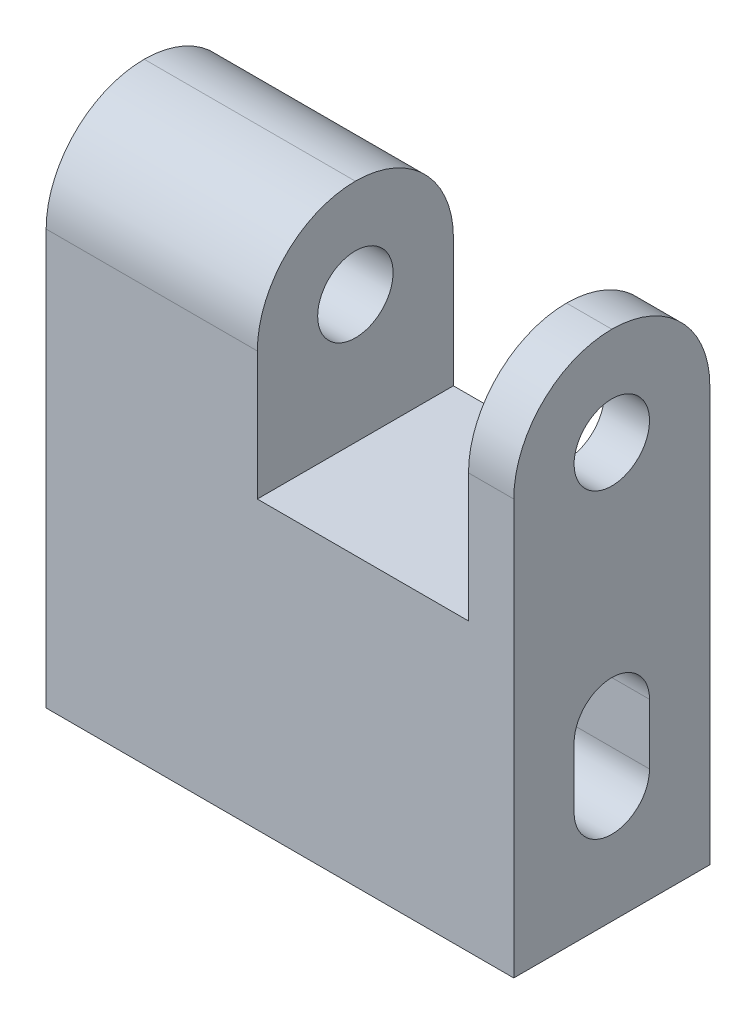
ISO-10303-21;
HEADER;
FILE_DESCRIPTION(('STEP AP214'),'2;1');
FILE_NAME('part.step','',(''),(''),'','','');
FILE_SCHEMA(('AUTOMOTIVE_DESIGN { 1 0 10303 214 1 1 1 1 }'));
ENDSEC;
DATA;
#1=APPLICATION_CONTEXT('core data for automotive mechanical design processes');
#2=APPLICATION_PROTOCOL_DEFINITION('international standard','automotive_design',2000,#1);
#3=PRODUCT_CONTEXT('',#1,'mechanical');
#4=PRODUCT('Part','Part','',(#3));
#5=PRODUCT_RELATED_PRODUCT_CATEGORY('part','',(#4));
#6=PRODUCT_DEFINITION_FORMATION('','',#4);
#7=PRODUCT_DEFINITION_CONTEXT('part definition',#1,'design');
#8=PRODUCT_DEFINITION('design','',#6,#7);
#9=PRODUCT_DEFINITION_SHAPE('','',#8);
#10=(LENGTH_UNIT() NAMED_UNIT(*) SI_UNIT(.MILLI.,.METRE.));
#11=(NAMED_UNIT(*) PLANE_ANGLE_UNIT() SI_UNIT($,.RADIAN.));
#12=(NAMED_UNIT(*) SI_UNIT($,.STERADIAN.) SOLID_ANGLE_UNIT());
#13=UNCERTAINTY_MEASURE_WITH_UNIT(LENGTH_MEASURE(1.E-05),#10,'distance_accuracy_value','');
#14=(GEOMETRIC_REPRESENTATION_CONTEXT(3) GLOBAL_UNCERTAINTY_ASSIGNED_CONTEXT((#13)) GLOBAL_UNIT_ASSIGNED_CONTEXT((#10,
#11,#12)) REPRESENTATION_CONTEXT('',''));
#15=CARTESIAN_POINT('',(0.,0.,0.));
#16=DIRECTION('',(0.,0.,1.));
#17=DIRECTION('',(1.,0.,0.));
#18=AXIS2_PLACEMENT_3D('',#15,#16,#17);
#19=CARTESIAN_POINT('',(0.,0.,13.));
#20=DIRECTION('',(1.,0.,0.));
#21=DIRECTION('',(0.,1.,0.));
#22=AXIS2_PLACEMENT_3D('',#19,#20,#21);
#23=PLANE('',#22);
#24=CARTESIAN_POINT('',(0.,-6.5,6.5));
#25=DIRECTION('',(1.,0.,0.));
#26=DIRECTION('',(0.,1.,0.));
#27=AXIS2_PLACEMENT_3D('',#24,#25,#26);
#28=CIRCLE('',#27,2.5);
#29=CARTESIAN_POINT('',(0.,-4.,6.5));
#30=VERTEX_POINT('',#29);
#31=EDGE_CURVE('E231',#30,#30,#28,.T.);
#32=ORIENTED_EDGE('',*,*,#31,.T.);
#33=EDGE_LOOP('',(#32));
#34=FACE_BOUND('',#33,.T.);
#35=DIRECTION('',(0.,1.,0.));
#36=VECTOR('',#35,1.);
#37=CARTESIAN_POINT('',(0.,-26.5,9.));
#38=LINE('',#37,#36);
#39=CARTESIAN_POINT('',(0.,-26.5,9.));
#40=VERTEX_POINT('',#39);
#41=CARTESIAN_POINT('',(0.,-22.5,9.));
#42=VERTEX_POINT('',#41);
#43=EDGE_CURVE('E178',#40,#42,#38,.T.);
#44=ORIENTED_EDGE('',*,*,#43,.F.);
#45=CARTESIAN_POINT('',(0.,-26.5,6.5));
#46=DIRECTION('',(-1.,0.,0.));
#47=DIRECTION('',(0.,-1.,0.));
#48=AXIS2_PLACEMENT_3D('',#45,#46,#47);
#49=CIRCLE('',#48,2.5);
#50=CARTESIAN_POINT('',(0.,-26.5,4.));
#51=VERTEX_POINT('',#50);
#52=EDGE_CURVE('E149',#51,#40,#49,.T.);
#53=ORIENTED_EDGE('',*,*,#52,.F.);
#54=DIRECTION('',(0.,1.,0.));
#55=VECTOR('',#54,1.);
#56=CARTESIAN_POINT('',(0.,-26.5,4.));
#57=LINE('',#56,#55);
#58=CARTESIAN_POINT('',(0.,-22.5,4.));
#59=VERTEX_POINT('',#58);
#60=EDGE_CURVE('E166',#51,#59,#57,.T.);
#61=ORIENTED_EDGE('',*,*,#60,.T.);
#62=CARTESIAN_POINT('',(0.,-22.5,6.5));
#63=DIRECTION('',(-1.,0.,0.));
#64=DIRECTION('',(0.,-1.,0.));
#65=AXIS2_PLACEMENT_3D('',#62,#63,#64);
#66=CIRCLE('',#65,2.5);
#67=EDGE_CURVE('E169',#42,#59,#66,.T.);
#68=ORIENTED_EDGE('',*,*,#67,.F.);
#69=EDGE_LOOP('',(#44,#53,#61,#68));
#70=FACE_BOUND('',#69,.T.);
#71=DIRECTION('',(0.,-1.,0.));
#72=VECTOR('',#71,1.);
#73=CARTESIAN_POINT('',(0.,0.,13.));
#74=LINE('',#73,#72);
#75=CARTESIAN_POINT('',(0.,-6.5,13.));
#76=VERTEX_POINT('',#75);
#77=CARTESIAN_POINT('',(0.,-34.,13.));
#78=VERTEX_POINT('',#77);
#79=EDGE_CURVE('E188',#76,#78,#74,.T.);
#80=ORIENTED_EDGE('',*,*,#79,.F.);
#81=CARTESIAN_POINT('',(0.,-6.5,6.5));
#82=DIRECTION('',(1.,0.,0.));
#83=DIRECTION('',(0.,1.,0.));
#84=AXIS2_PLACEMENT_3D('',#81,#82,#83);
#85=CIRCLE('',#84,6.5);
#86=CARTESIAN_POINT('',(0.,0.,6.5));
#87=VERTEX_POINT('',#86);
#88=EDGE_CURVE('E247',#76,#87,#85,.F.);
#89=ORIENTED_EDGE('',*,*,#88,.T.);
#90=CARTESIAN_POINT('',(0.,-6.5,6.5));
#91=DIRECTION('',(1.,0.,0.));
#92=DIRECTION('',(0.,1.,0.));
#93=AXIS2_PLACEMENT_3D('',#90,#91,#92);
#94=CIRCLE('',#93,6.5);
#95=CARTESIAN_POINT('',(0.,-6.5,0.));
#96=VERTEX_POINT('',#95);
#97=EDGE_CURVE('E245',#87,#96,#94,.F.);
#98=ORIENTED_EDGE('',*,*,#97,.T.);
#99=DIRECTION('',(0.,-1.,0.));
#100=VECTOR('',#99,1.);
#101=CARTESIAN_POINT('',(0.,0.,0.));
#102=LINE('',#101,#100);
#103=CARTESIAN_POINT('',(0.,-34.,0.));
#104=VERTEX_POINT('',#103);
#105=EDGE_CURVE('E184',#96,#104,#102,.T.);
#106=ORIENTED_EDGE('',*,*,#105,.T.);
#107=DIRECTION('',(0.,0.,-1.));
#108=VECTOR('',#107,1.);
#109=CARTESIAN_POINT('',(0.,-34.,13.));
#110=LINE('',#109,#108);
#111=EDGE_CURVE('E223',#78,#104,#110,.T.);
#112=ORIENTED_EDGE('',*,*,#111,.F.);
#113=EDGE_LOOP('',(#80,#89,#98,#106,#112));
#114=FACE_BOUND('',#113,.T.);
#115=ADVANCED_FACE('F35',(#34,#70,#114),#23,.F.);
#116=CARTESIAN_POINT('',(0.,-34.,13.));
#117=DIRECTION('',(0.,1.,0.));
#118=DIRECTION('',(0.,0.,1.));
#119=AXIS2_PLACEMENT_3D('',#116,#117,#118);
#120=PLANE('',#119);
#121=CARTESIAN_POINT('',(15.5,-34.,6.5));
#122=DIRECTION('',(0.,-1.,0.));
#123=DIRECTION('',(1.,0.,0.));
#124=AXIS2_PLACEMENT_3D('',#121,#122,#123);
#125=CIRCLE('',#124,2.);
#126=CARTESIAN_POINT('',(17.5,-34.,6.5));
#127=VERTEX_POINT('',#126);
#128=EDGE_CURVE('E260',#127,#127,#125,.T.);
#129=ORIENTED_EDGE('',*,*,#128,.F.);
#130=EDGE_LOOP('',(#129));
#131=FACE_BOUND('',#130,.T.);
#132=DIRECTION('',(1.,0.,0.));
#133=VECTOR('',#132,1.);
#134=CARTESIAN_POINT('',(0.,-34.,0.));
#135=LINE('',#134,#133);
#136=CARTESIAN_POINT('',(31.,-34.,0.));
#137=VERTEX_POINT('',#136);
#138=EDGE_CURVE('E205',#104,#137,#135,.T.);
#139=ORIENTED_EDGE('',*,*,#138,.T.);
#140=DIRECTION('',(0.,0.,-1.));
#141=VECTOR('',#140,1.);
#142=CARTESIAN_POINT('',(31.,-34.,13.));
#143=LINE('',#142,#141);
#144=CARTESIAN_POINT('',(31.,-34.,13.));
#145=VERTEX_POINT('',#144);
#146=EDGE_CURVE('E220',#145,#137,#143,.T.);
#147=ORIENTED_EDGE('',*,*,#146,.F.);
#148=DIRECTION('',(1.,0.,0.));
#149=VECTOR('',#148,1.);
#150=CARTESIAN_POINT('',(0.,-34.,13.));
#151=LINE('',#150,#149);
#152=EDGE_CURVE('E190',#78,#145,#151,.T.);
#153=ORIENTED_EDGE('',*,*,#152,.F.);
#154=ORIENTED_EDGE('',*,*,#111,.T.);
#155=EDGE_LOOP('',(#139,#147,#153,#154));
#156=FACE_BOUND('',#155,.T.);
#157=ADVANCED_FACE('F292',(#131,#156),#120,.F.);
#158=CARTESIAN_POINT('',(31.,-34.,13.));
#159=DIRECTION('',(-1.,0.,0.));
#160=DIRECTION('',(0.,-1.,0.));
#161=AXIS2_PLACEMENT_3D('',#158,#159,#160);
#162=PLANE('',#161);
#163=CARTESIAN_POINT('',(31.,-6.5,6.5));
#164=DIRECTION('',(-1.,0.,0.));
#165=DIRECTION('',(0.,-1.,0.));
#166=AXIS2_PLACEMENT_3D('',#163,#164,#165);
#167=CIRCLE('',#166,2.5);
#168=CARTESIAN_POINT('',(31.,-4.,6.5));
#169=VERTEX_POINT('',#168);
#170=EDGE_CURVE('E172',#169,#169,#167,.T.);
#171=ORIENTED_EDGE('',*,*,#170,.T.);
#172=EDGE_LOOP('',(#171));
#173=FACE_BOUND('',#172,.T.);
#174=DIRECTION('',(0.,1.,0.));
#175=VECTOR('',#174,1.);
#176=CARTESIAN_POINT('',(31.,-26.5,4.));
#177=LINE('',#176,#175);
#178=CARTESIAN_POINT('',(31.,-26.5,4.));
#179=VERTEX_POINT('',#178);
#180=CARTESIAN_POINT('',(31.,-22.5,4.));
#181=VERTEX_POINT('',#180);
#182=EDGE_CURVE('E154',#179,#181,#177,.T.);
#183=ORIENTED_EDGE('',*,*,#182,.F.);
#184=CARTESIAN_POINT('',(31.,-26.5,6.5));
#185=DIRECTION('',(-1.,0.,0.));
#186=DIRECTION('',(0.,-1.,0.));
#187=AXIS2_PLACEMENT_3D('',#184,#185,#186);
#188=CIRCLE('',#187,2.5);
#189=CARTESIAN_POINT('',(31.,-26.5,9.));
#190=VERTEX_POINT('',#189);
#191=EDGE_CURVE('E146',#179,#190,#188,.T.);
#192=ORIENTED_EDGE('',*,*,#191,.T.);
#193=DIRECTION('',(0.,1.,0.));
#194=VECTOR('',#193,1.);
#195=CARTESIAN_POINT('',(31.,-26.5,9.));
#196=LINE('',#195,#194);
#197=CARTESIAN_POINT('',(31.,-22.5,9.));
#198=VERTEX_POINT('',#197);
#199=EDGE_CURVE('E158',#190,#198,#196,.T.);
#200=ORIENTED_EDGE('',*,*,#199,.T.);
#201=CARTESIAN_POINT('',(31.,-22.5,6.5));
#202=DIRECTION('',(-1.,0.,0.));
#203=DIRECTION('',(0.,-1.,0.));
#204=AXIS2_PLACEMENT_3D('',#201,#202,#203);
#205=CIRCLE('',#204,2.5);
#206=EDGE_CURVE('E162',#198,#181,#205,.T.);
#207=ORIENTED_EDGE('',*,*,#206,.T.);
#208=EDGE_LOOP('',(#183,#192,#200,#207));
#209=FACE_BOUND('',#208,.T.);
#210=CARTESIAN_POINT('',(31.,-6.5,6.5));
#211=DIRECTION('',(-1.,0.,0.));
#212=DIRECTION('',(0.,-1.,0.));
#213=AXIS2_PLACEMENT_3D('',#210,#211,#212);
#214=CIRCLE('',#213,6.5);
#215=CARTESIAN_POINT('',(31.,-6.5,0.));
#216=VERTEX_POINT('',#215);
#217=CARTESIAN_POINT('',(31.,0.,6.5));
#218=VERTEX_POINT('',#217);
#219=EDGE_CURVE('E241',#216,#218,#214,.F.);
#220=ORIENTED_EDGE('',*,*,#219,.T.);
#221=CARTESIAN_POINT('',(31.,-6.5,6.5));
#222=DIRECTION('',(-1.,0.,0.));
#223=DIRECTION('',(0.,-1.,0.));
#224=AXIS2_PLACEMENT_3D('',#221,#222,#223);
#225=CIRCLE('',#224,6.5);
#226=CARTESIAN_POINT('',(31.,-6.5,13.));
#227=VERTEX_POINT('',#226);
#228=EDGE_CURVE('E243',#218,#227,#225,.F.);
#229=ORIENTED_EDGE('',*,*,#228,.T.);
#230=DIRECTION('',(0.,1.,0.));
#231=VECTOR('',#230,1.);
#232=CARTESIAN_POINT('',(31.,-34.,13.));
#233=LINE('',#232,#231);
#234=EDGE_CURVE('E193',#145,#227,#233,.T.);
#235=ORIENTED_EDGE('',*,*,#234,.F.);
#236=ORIENTED_EDGE('',*,*,#146,.T.);
#237=DIRECTION('',(0.,1.,0.));
#238=VECTOR('',#237,1.);
#239=CARTESIAN_POINT('',(31.,-34.,0.));
#240=LINE('',#239,#238);
#241=EDGE_CURVE('E207',#137,#216,#240,.T.);
#242=ORIENTED_EDGE('',*,*,#241,.T.);
#243=EDGE_LOOP('',(#220,#229,#235,#236,#242));
#244=FACE_BOUND('',#243,.T.);
#245=ADVANCED_FACE('F164',(#173,#209,#244),#162,.F.);
#246=CARTESIAN_POINT('',(28.,0.,13.));
#247=DIRECTION('',(1.,0.,0.));
#248=DIRECTION('',(0.,1.,0.));
#249=AXIS2_PLACEMENT_3D('',#246,#247,#248);
#250=PLANE('',#249);
#251=CARTESIAN_POINT('',(28.,-6.5,6.5));
#252=DIRECTION('',(1.,0.,0.));
#253=DIRECTION('',(0.,1.,0.));
#254=AXIS2_PLACEMENT_3D('',#251,#252,#253);
#255=CIRCLE('',#254,2.5);
#256=CARTESIAN_POINT('',(28.,-4.,6.5));
#257=VERTEX_POINT('',#256);
#258=EDGE_CURVE('E230',#257,#257,#255,.T.);
#259=ORIENTED_EDGE('',*,*,#258,.T.);
#260=EDGE_LOOP('',(#259));
#261=FACE_BOUND('',#260,.T.);
#262=DIRECTION('',(0.,-1.,0.));
#263=VECTOR('',#262,1.);
#264=CARTESIAN_POINT('',(28.,0.,13.));
#265=LINE('',#264,#263);
#266=CARTESIAN_POINT('',(28.,-6.5,13.));
#267=VERTEX_POINT('',#266);
#268=CARTESIAN_POINT('',(28.,-15.,13.));
#269=VERTEX_POINT('',#268);
#270=EDGE_CURVE('E196',#267,#269,#265,.T.);
#271=ORIENTED_EDGE('',*,*,#270,.F.);
#272=CARTESIAN_POINT('',(28.,-6.5,6.5));
#273=DIRECTION('',(1.,0.,0.));
#274=DIRECTION('',(0.,1.,0.));
#275=AXIS2_PLACEMENT_3D('',#272,#273,#274);
#276=CIRCLE('',#275,6.5);
#277=CARTESIAN_POINT('',(28.,0.,6.5));
#278=VERTEX_POINT('',#277);
#279=EDGE_CURVE('E239',#267,#278,#276,.F.);
#280=ORIENTED_EDGE('',*,*,#279,.T.);
#281=CARTESIAN_POINT('',(28.,-6.5,6.5));
#282=DIRECTION('',(1.,0.,0.));
#283=DIRECTION('',(0.,1.,0.));
#284=AXIS2_PLACEMENT_3D('',#281,#282,#283);
#285=CIRCLE('',#284,6.5);
#286=CARTESIAN_POINT('',(28.,-6.5,0.));
#287=VERTEX_POINT('',#286);
#288=EDGE_CURVE('E237',#278,#287,#285,.F.);
#289=ORIENTED_EDGE('',*,*,#288,.T.);
#290=DIRECTION('',(0.,-1.,0.));
#291=VECTOR('',#290,1.);
#292=CARTESIAN_POINT('',(28.,0.,0.));
#293=LINE('',#292,#291);
#294=CARTESIAN_POINT('',(28.,-15.,0.));
#295=VERTEX_POINT('',#294);
#296=EDGE_CURVE('E210',#287,#295,#293,.T.);
#297=ORIENTED_EDGE('',*,*,#296,.T.);
#298=DIRECTION('',(0.,0.,-1.));
#299=VECTOR('',#298,1.);
#300=CARTESIAN_POINT('',(28.,-15.,13.));
#301=LINE('',#300,#299);
#302=EDGE_CURVE('E217',#269,#295,#301,.T.);
#303=ORIENTED_EDGE('',*,*,#302,.F.);
#304=EDGE_LOOP('',(#271,#280,#289,#297,#303));
#305=FACE_BOUND('',#304,.T.);
#306=ADVANCED_FACE('F344',(#261,#305),#250,.F.);
#307=CARTESIAN_POINT('',(28.,-15.,13.));
#308=DIRECTION('',(0.,-1.,0.));
#309=DIRECTION('',(1.,0.,0.));
#310=AXIS2_PLACEMENT_3D('',#307,#308,#309);
#311=PLANE('',#310);
#312=DIRECTION('',(-1.,0.,0.));
#313=VECTOR('',#312,1.);
#314=CARTESIAN_POINT('',(28.,-15.,0.));
#315=LINE('',#314,#313);
#316=CARTESIAN_POINT('',(14.,-15.,0.));
#317=VERTEX_POINT('',#316);
#318=EDGE_CURVE('E212',#295,#317,#315,.T.);
#319=ORIENTED_EDGE('',*,*,#318,.T.);
#320=DIRECTION('',(0.,0.,-1.));
#321=VECTOR('',#320,1.);
#322=CARTESIAN_POINT('',(14.,-15.,13.));
#323=LINE('',#322,#321);
#324=CARTESIAN_POINT('',(14.,-15.,13.));
#325=VERTEX_POINT('',#324);
#326=EDGE_CURVE('E203',#325,#317,#323,.T.);
#327=ORIENTED_EDGE('',*,*,#326,.F.);
#328=DIRECTION('',(-1.,0.,0.));
#329=VECTOR('',#328,1.);
#330=CARTESIAN_POINT('',(28.,-15.,13.));
#331=LINE('',#330,#329);
#332=EDGE_CURVE('E198',#269,#325,#331,.T.);
#333=ORIENTED_EDGE('',*,*,#332,.F.);
#334=ORIENTED_EDGE('',*,*,#302,.T.);
#335=EDGE_LOOP('',(#319,#327,#333,#334));
#336=FACE_BOUND('',#335,.T.);
#337=ADVANCED_FACE('F324',(#336),#311,.F.);
#338=CARTESIAN_POINT('',(14.,-15.,13.));
#339=DIRECTION('',(-1.,0.,0.));
#340=DIRECTION('',(0.,0.,1.));
#341=AXIS2_PLACEMENT_3D('',#338,#339,#340);
#342=PLANE('',#341);
#343=CARTESIAN_POINT('',(14.,-6.5,6.5));
#344=DIRECTION('',(-1.,0.,0.));
#345=DIRECTION('',(0.,0.,1.));
#346=AXIS2_PLACEMENT_3D('',#343,#344,#345);
#347=CIRCLE('',#346,2.5);
#348=CARTESIAN_POINT('',(14.,-6.5,9.));
#349=VERTEX_POINT('',#348);
#350=EDGE_CURVE('E227',#349,#349,#347,.T.);
#351=ORIENTED_EDGE('',*,*,#350,.T.);
#352=EDGE_LOOP('',(#351));
#353=FACE_BOUND('',#352,.T.);
#354=CARTESIAN_POINT('',(14.,-6.5,6.5));
#355=DIRECTION('',(-1.,0.,0.));
#356=DIRECTION('',(0.,0.,1.));
#357=AXIS2_PLACEMENT_3D('',#354,#355,#356);
#358=CIRCLE('',#357,6.5);
#359=CARTESIAN_POINT('',(14.,-6.5,0.));
#360=VERTEX_POINT('',#359);
#361=CARTESIAN_POINT('',(14.,0.,6.5));
#362=VERTEX_POINT('',#361);
#363=EDGE_CURVE('E56',#360,#362,#358,.F.);
#364=ORIENTED_EDGE('',*,*,#363,.T.);
#365=CARTESIAN_POINT('',(14.,-6.5,6.5));
#366=DIRECTION('',(-1.,0.,0.));
#367=DIRECTION('',(0.,0.,1.));
#368=AXIS2_PLACEMENT_3D('',#365,#366,#367);
#369=CIRCLE('',#368,6.5);
#370=CARTESIAN_POINT('',(14.,-6.5,13.));
#371=VERTEX_POINT('',#370);
#372=EDGE_CURVE('E250',#362,#371,#369,.F.);
#373=ORIENTED_EDGE('',*,*,#372,.T.);
#374=DIRECTION('',(0.,1.,0.));
#375=VECTOR('',#374,1.);
#376=CARTESIAN_POINT('',(14.,-15.,13.));
#377=LINE('',#376,#375);
#378=EDGE_CURVE('E200',#325,#371,#377,.T.);
#379=ORIENTED_EDGE('',*,*,#378,.F.);
#380=ORIENTED_EDGE('',*,*,#326,.T.);
#381=DIRECTION('',(0.,1.,0.));
#382=VECTOR('',#381,1.);
#383=CARTESIAN_POINT('',(14.,-15.,0.));
#384=LINE('',#383,#382);
#385=EDGE_CURVE('E191',#317,#360,#384,.T.);
#386=ORIENTED_EDGE('',*,*,#385,.T.);
#387=EDGE_LOOP('',(#364,#373,#379,#380,#386));
#388=FACE_BOUND('',#387,.T.);
#389=ADVANCED_FACE('F315',(#353,#388),#342,.F.);
#390=CARTESIAN_POINT('',(0.,0.,13.));
#391=DIRECTION('',(0.,0.,1.));
#392=DIRECTION('',(1.,0.,0.));
#393=AXIS2_PLACEMENT_3D('',#390,#391,#392);
#394=PLANE('',#393);
#395=ORIENTED_EDGE('',*,*,#234,.T.);
#396=DIRECTION('',(-1.,0.,0.));
#397=VECTOR('',#396,1.);
#398=CARTESIAN_POINT('',(28.,-6.5,13.));
#399=LINE('',#398,#397);
#400=EDGE_CURVE('E234',#227,#267,#399,.T.);
#401=ORIENTED_EDGE('',*,*,#400,.T.);
#402=ORIENTED_EDGE('',*,*,#270,.T.);
#403=ORIENTED_EDGE('',*,*,#332,.T.);
#404=ORIENTED_EDGE('',*,*,#378,.T.);
#405=DIRECTION('',(-1.,0.,0.));
#406=VECTOR('',#405,1.);
#407=CARTESIAN_POINT('',(0.,-6.5,13.));
#408=LINE('',#407,#406);
#409=EDGE_CURVE('E226',#371,#76,#408,.T.);
#410=ORIENTED_EDGE('',*,*,#409,.T.);
#411=ORIENTED_EDGE('',*,*,#79,.T.);
#412=ORIENTED_EDGE('',*,*,#152,.T.);
#413=EDGE_LOOP('',(#395,#401,#402,#403,#404,#410,#411,#412));
#414=FACE_BOUND('',#413,.T.);
#415=ADVANCED_FACE('F317',(#414),#394,.T.);
#416=CARTESIAN_POINT('',(0.,0.,0.));
#417=DIRECTION('',(0.,0.,1.));
#418=DIRECTION('',(1.,0.,0.));
#419=AXIS2_PLACEMENT_3D('',#416,#417,#418);
#420=PLANE('',#419);
#421=ORIENTED_EDGE('',*,*,#105,.F.);
#422=DIRECTION('',(-1.,0.,0.));
#423=VECTOR('',#422,1.);
#424=CARTESIAN_POINT('',(0.,-6.5,0.));
#425=LINE('',#424,#423);
#426=EDGE_CURVE('E11',#96,#360,#425,.F.);
#427=ORIENTED_EDGE('',*,*,#426,.T.);
#428=ORIENTED_EDGE('',*,*,#385,.F.);
#429=ORIENTED_EDGE('',*,*,#318,.F.);
#430=ORIENTED_EDGE('',*,*,#296,.F.);
#431=DIRECTION('',(-1.,0.,0.));
#432=VECTOR('',#431,1.);
#433=CARTESIAN_POINT('',(0.,-6.5,0.));
#434=LINE('',#433,#432);
#435=EDGE_CURVE('E48',#287,#216,#434,.F.);
#436=ORIENTED_EDGE('',*,*,#435,.T.);
#437=ORIENTED_EDGE('',*,*,#241,.F.);
#438=ORIENTED_EDGE('',*,*,#138,.F.);
#439=EDGE_LOOP('',(#421,#427,#428,#429,#430,#436,#437,#438));
#440=FACE_BOUND('',#439,.T.);
#441=ADVANCED_FACE('F326',(#440),#420,.F.);
#442=CARTESIAN_POINT('',(31.,-26.5,6.5));
#443=DIRECTION('',(-1.,0.,0.));
#444=DIRECTION('',(0.,-1.,0.));
#445=AXIS2_PLACEMENT_3D('',#442,#443,#444);
#446=CYLINDRICAL_SURFACE('',#445,2.5);
#447=CARTESIAN_POINT('',(17.5,-29.,6.5));
#448=CARTESIAN_POINT('',(17.4999924205671,-28.999992649474,6.59599689643887));
#449=CARTESIAN_POINT('',(17.4930305713364,-28.9944136841191,6.69213319296467));
#450=CARTESIAN_POINT('',(17.4656500599583,-28.972592693606,6.88131936547741));
#451=CARTESIAN_POINT('',(17.4452016287381,-28.9563270800038,6.97436193432133));
#452=CARTESIAN_POINT('',(17.3923217211049,-28.9146672181517,7.15409491682451));
#453=CARTESIAN_POINT('',(17.3599666485686,-28.8893312014417,7.24082169812805));
#454=CARTESIAN_POINT('',(17.2848826565227,-28.831360109966,7.40692632369254));
#455=CARTESIAN_POINT('',(17.2421537041494,-28.7987250120775,7.4863041446715));
#456=CARTESIAN_POINT('',(17.1313716349689,-28.7157566472895,7.66318123656703));
#457=CARTESIAN_POINT('',(17.0596810848259,-28.6632174860322,7.75736767952115));
#458=CARTESIAN_POINT('',(16.9027219342605,-28.5529219260303,7.93041367827883));
#459=CARTESIAN_POINT('',(16.8174142464966,-28.4951507220051,8.00922761533153));
#460=CARTESIAN_POINT('',(16.6332260159273,-28.3785600162984,8.1521591895554));
#461=CARTESIAN_POINT('',(16.5341532270239,-28.3197383090203,8.21602638457222));
#462=CARTESIAN_POINT('',(16.3234612174958,-28.2088210988299,8.32646834413604));
#463=CARTESIAN_POINT('',(16.211885666112,-28.1567034708917,8.37310099386401));
#464=CARTESIAN_POINT('',(16.026121048323,-28.0883565230093,8.43086043771818));
#465=CARTESIAN_POINT('',(15.9561882620197,-28.0662872777019,8.44865475820658));
#466=CARTESIAN_POINT('',(15.8127873158795,-28.0306988915583,8.47673396798331));
#467=CARTESIAN_POINT('',(15.739328326475,-28.0171587417974,8.48703731881776));
#468=CARTESIAN_POINT('',(15.589807481129,-28.000842340611,8.49939840142554));
#469=CARTESIAN_POINT('',(15.5137285151792,-27.9981609692656,8.50138345613423));
#470=CARTESIAN_POINT('',(15.3622951079673,-28.0043996230281,8.49669481699685));
#471=CARTESIAN_POINT('',(15.2869413342337,-28.0133294666024,8.49001379511087));
#472=CARTESIAN_POINT('',(15.1277776973873,-28.0432072129997,8.4669530271194));
#473=CARTESIAN_POINT('',(15.044491993946,-28.0658184204953,8.44921808205621));
#474=CARTESIAN_POINT('',(14.883464440463,-28.1199745993628,8.40444547348848));
#475=CARTESIAN_POINT('',(14.8057398434602,-28.1515459819864,8.37738025642251));
#476=CARTESIAN_POINT('',(14.619337893959,-28.2365611615942,8.29974102194077));
#477=CARTESIAN_POINT('',(14.5141973016958,-28.2931337296815,8.24414886595503));
#478=CARTESIAN_POINT('',(14.3162833222007,-28.4091378006069,8.11638467497537));
#479=CARTESIAN_POINT('',(14.2235282791565,-28.4685733704894,8.04418846902464));
#480=CARTESIAN_POINT('',(14.0487252285949,-28.5861275196845,7.88145818326396));
#481=CARTESIAN_POINT('',(13.9670280776942,-28.6441688926078,7.79048701026967));
#482=CARTESIAN_POINT('',(13.8199005005657,-28.7517187149499,7.59198491072666));
#483=CARTESIAN_POINT('',(13.7544264838828,-28.8012499182245,7.48449964520107));
#484=CARTESIAN_POINT('',(13.6594371525901,-28.8742458564332,7.28777781438055));
#485=CARTESIAN_POINT('',(13.6249954955609,-28.9011107122417,7.2021777273292));
#486=CARTESIAN_POINT('',(13.567873549012,-28.9459756411142,7.02491392373715));
#487=CARTESIAN_POINT('',(13.5451843950545,-28.9639823949691,6.93325483627228));
#488=CARTESIAN_POINT('',(13.5128614530642,-28.9897033568521,6.74571323384492));
#489=CARTESIAN_POINT('',(13.503295875255,-28.9973637863367,6.64981130721261));
#490=CARTESIAN_POINT('',(13.4981409510237,-29.0014868270186,6.45739199713248));
#491=CARTESIAN_POINT('',(13.5025490011779,-28.9979515240906,6.36087473167203));
#492=CARTESIAN_POINT('',(13.5240828162477,-28.9807685864295,6.17825332584453));
#493=CARTESIAN_POINT('',(13.540149175139,-28.9679635240506,6.09193910824343));
#494=CARTESIAN_POINT('',(13.5828721811016,-28.9341751321347,5.92366432577128));
#495=CARTESIAN_POINT('',(13.6095319710966,-28.9131893755344,5.84170506114306));
#496=CARTESIAN_POINT('',(13.6741503717839,-28.8628984943133,5.67876412245109));
#497=CARTESIAN_POINT('',(13.7127057859564,-28.8331591273687,5.59815638058094));
#498=CARTESIAN_POINT('',(13.7988621516328,-28.7678362272214,5.44458999551669));
#499=CARTESIAN_POINT('',(13.8464635542345,-28.7322524025842,5.37163173406212));
#500=CARTESIAN_POINT('',(13.9592243182969,-28.649936875224,5.22074762430857));
#501=CARTESIAN_POINT('',(14.026001690483,-28.6023696976822,5.14449281021871));
#502=CARTESIAN_POINT('',(14.169386961371,-28.5044349795202,5.0034631240247));
#503=CARTESIAN_POINT('',(14.2460228368388,-28.454059709911,4.93872222272633));
#504=CARTESIAN_POINT('',(14.3764344432366,-28.3737413531714,4.84431512069213));
#505=CARTESIAN_POINT('',(14.4273605907533,-28.3435474368546,4.81086258207348));
#506=CARTESIAN_POINT('',(14.5326222614236,-28.2843541552113,4.74844998079456));
#507=CARTESIAN_POINT('',(14.5869595718808,-28.2553554295189,4.71949230131024));
#508=CARTESIAN_POINT('',(14.6988748402817,-28.19983828793,4.66641910040183));
#509=CARTESIAN_POINT('',(14.7564397672437,-28.1733109077483,4.64228568312345));
#510=CARTESIAN_POINT('',(14.875008978504,-28.1241020986769,4.59911518041365));
#511=CARTESIAN_POINT('',(14.9360107375195,-28.1014178938043,4.5800744106845));
#512=CARTESIAN_POINT('',(15.0660867242378,-28.0601942022258,4.54639834110917));
#513=CARTESIAN_POINT('',(15.1354226649404,-28.0420971671477,4.53220440275001));
#514=CARTESIAN_POINT('',(15.2768376127381,-28.0149337159379,4.51121094380633));
#515=CARTESIAN_POINT('',(15.3489092204505,-28.0058445230752,4.50439276925242));
#516=CARTESIAN_POINT('',(15.4943487054641,-27.9982473677972,4.49867941283454));
#517=CARTESIAN_POINT('',(15.5677214541542,-27.9997962591844,4.49982680220211));
#518=CARTESIAN_POINT('',(15.7129841930231,-28.0133077169599,4.51003480455796));
#519=CARTESIAN_POINT('',(15.7848716473261,-28.0252867934739,4.51910796346213));
#520=CARTESIAN_POINT('',(15.9446067743446,-28.0620707675608,4.54792254247285));
#521=CARTESIAN_POINT('',(16.0314230824911,-28.0894925841937,4.56990769591358));
#522=CARTESIAN_POINT('',(16.1986334786896,-28.1528890764241,4.62391822782569));
#523=CARTESIAN_POINT('',(16.2790077600367,-28.1888888721129,4.65597318457437));
#524=CARTESIAN_POINT('',(16.4121777220462,-28.2549115872444,4.71905253688533));
#525=CARTESIAN_POINT('',(16.4665191815183,-28.2838890732501,4.74797636809591));
#526=CARTESIAN_POINT('',(16.5718382298173,-28.34307948739,4.81035266217538));
#527=CARTESIAN_POINT('',(16.6228145849512,-28.3732928621151,4.84380677234098));
#528=CARTESIAN_POINT('',(16.7707794032988,-28.4643799775812,4.9508156442929));
#529=CARTESIAN_POINT('',(16.8627986866625,-28.525698084814,5.03101458359491));
#530=CARTESIAN_POINT('',(17.0333894648308,-28.6441827878711,5.2099828114157));
#531=CARTESIAN_POINT('',(17.1117702242368,-28.701284919641,5.30898033842353));
#532=CARTESIAN_POINT('',(17.2155767294168,-28.7787465080453,5.47001600100454));
#533=CARTESIAN_POINT('',(17.2478684441351,-28.8031886810933,5.52574459980031));
#534=CARTESIAN_POINT('',(17.3073681009614,-28.848661154656,5.64114517137197));
#535=CARTESIAN_POINT('',(17.3345791544845,-28.8696935422891,5.70081470019465));
#536=CARTESIAN_POINT('',(17.3917800598956,-28.914209055115,5.84496226057576));
#537=CARTESIAN_POINT('',(17.4194826718009,-28.9360289288763,5.93088976040989));
#538=CARTESIAN_POINT('',(17.4631576733877,-28.9705886497684,6.10728690257229));
#539=CARTESIAN_POINT('',(17.4791607887746,-28.9833522781687,6.19774397589688));
#540=CARTESIAN_POINT('',(17.4925630255603,-28.994053783091,6.3241190690801));
#541=CARTESIAN_POINT('',(17.4953473787458,-28.9962791876343,6.35919144717873));
#542=CARTESIAN_POINT('',(17.4990674635275,-28.999253810179,6.42950292510818));
#543=CARTESIAN_POINT('',(17.5000027837899,-29.0000026997165,6.46474206028827));
#544=CARTESIAN_POINT('',(17.5,-29.,6.5));
#545=B_SPLINE_CURVE_WITH_KNOTS('',3,(#447,#448,#449,#450,#451,#452,#453,#454,#455,#456,#457,
#458,#459,#460,#461,#462,#463,#464,#465,#466,#467,#468,#469,#470,#471,#472,#473,#474,#475,#476,
#477,#478,#479,#480,#481,#482,#483,#484,#485,#486,#487,#488,#489,#490,#491,#492,#493,#494,#495,
#496,#497,#498,#499,#500,#501,#502,#503,#504,#505,#506,#507,#508,#509,#510,#511,#512,#513,#514,
#515,#516,#517,#518,#519,#520,#521,#522,#523,#524,#525,#526,#527,#528,#529,#530,#531,#532,#533,
#534,#535,#536,#537,#538,#539,#540,#541,#542,#543,#544),.UNSPECIFIED.,.T.,.F.,(4,2,2,2,2,2,2,2,
2,2,2,2,2,2,2,2,2,2,2,2,2,2,2,2,2,2,2,2,2,2,2,2,2,2,2,2,2,2,2,2,2,2,2,2,2,2,2,2,4),(0.,
0.287836605992208,0.576310692639342,0.862965057250607,1.14962032997081,1.53607888200101,
1.92366738187851,2.31734741765481,2.70969292925127,2.9353448634113,3.1604387740811,
3.38749528500759,3.61474392028823,3.87758630032011,4.14121163495706,4.53425748188301,
4.92787915886674,5.3319817328842,5.73498644040677,6.02213978124803,6.30907621738868,
6.59749843639965,6.88586692268771,7.15087004938159,7.41595185759573,7.69742753051566,
7.9789172435135,8.31365537249325,8.64936529970902,8.85316560745906,9.05707360380851,
9.26021055202079,9.46320013996582,9.68152133432597,9.89928907450685,10.1182215471168,
10.3375012031536,10.616933053181,10.8971934831173,11.1010640012511,11.3050088506911,
11.7129165318148,12.1261363563906,12.3324811048119,12.5386990694968,12.8161540735935,
13.0928777702216,13.1985714874516,13.3042887145431),.UNSPECIFIED.);
#546=CARTESIAN_POINT('',(17.5,-29.,6.5));
#547=VERTEX_POINT('',#546);
#548=EDGE_CURVE('E39',#547,#547,#545,.T.);
#549=ORIENTED_EDGE('',*,*,#548,.T.);
#550=EDGE_LOOP('',(#549));
#551=FACE_BOUND('',#550,.T.);
#552=ORIENTED_EDGE('',*,*,#52,.T.);
#553=DIRECTION('',(-1.,0.,0.));
#554=VECTOR('',#553,1.);
#555=CARTESIAN_POINT('',(31.,-26.5,9.));
#556=LINE('',#555,#554);
#557=EDGE_CURVE('E142',#190,#40,#556,.T.);
#558=ORIENTED_EDGE('',*,*,#557,.F.);
#559=ORIENTED_EDGE('',*,*,#191,.F.);
#560=DIRECTION('',(-1.,0.,0.));
#561=VECTOR('',#560,1.);
#562=CARTESIAN_POINT('',(31.,-26.5,4.));
#563=LINE('',#562,#561);
#564=EDGE_CURVE('E182',#179,#51,#563,.T.);
#565=ORIENTED_EDGE('',*,*,#564,.T.);
#566=EDGE_LOOP('',(#552,#558,#559,#565));
#567=FACE_BOUND('',#566,.T.);
#568=ADVANCED_FACE('F144',(#551,#567),#446,.F.);
#569=CARTESIAN_POINT('',(31.,-26.5,4.));
#570=DIRECTION('',(0.,0.,1.));
#571=DIRECTION('',(0.,-1.,0.));
#572=AXIS2_PLACEMENT_3D('',#569,#570,#571);
#573=PLANE('',#572);
#574=ORIENTED_EDGE('',*,*,#60,.F.);
#575=ORIENTED_EDGE('',*,*,#564,.F.);
#576=ORIENTED_EDGE('',*,*,#182,.T.);
#577=DIRECTION('',(-1.,0.,0.));
#578=VECTOR('',#577,1.);
#579=CARTESIAN_POINT('',(31.,-22.5,4.));
#580=LINE('',#579,#578);
#581=EDGE_CURVE('E185',#181,#59,#580,.T.);
#582=ORIENTED_EDGE('',*,*,#581,.T.);
#583=EDGE_LOOP('',(#574,#575,#576,#582));
#584=FACE_BOUND('',#583,.T.);
#585=ADVANCED_FACE('F362',(#584),#573,.T.);
#586=CARTESIAN_POINT('',(31.,-22.5,6.5));
#587=DIRECTION('',(-1.,0.,0.));
#588=DIRECTION('',(0.,-1.,0.));
#589=AXIS2_PLACEMENT_3D('',#586,#587,#588);
#590=CYLINDRICAL_SURFACE('',#589,2.5);
#591=ORIENTED_EDGE('',*,*,#67,.T.);
#592=ORIENTED_EDGE('',*,*,#581,.F.);
#593=ORIENTED_EDGE('',*,*,#206,.F.);
#594=DIRECTION('',(-1.,0.,0.));
#595=VECTOR('',#594,1.);
#596=CARTESIAN_POINT('',(31.,-22.5,9.));
#597=LINE('',#596,#595);
#598=EDGE_CURVE('E153',#198,#42,#597,.T.);
#599=ORIENTED_EDGE('',*,*,#598,.T.);
#600=EDGE_LOOP('',(#591,#592,#593,#599));
#601=FACE_BOUND('',#600,.T.);
#602=ADVANCED_FACE('F365',(#601),#590,.F.);
#603=CARTESIAN_POINT('',(31.,-26.5,9.));
#604=DIRECTION('',(0.,0.,1.));
#605=DIRECTION('',(1.,0.,0.));
#606=AXIS2_PLACEMENT_3D('',#603,#604,#605);
#607=PLANE('',#606);
#608=ORIENTED_EDGE('',*,*,#43,.T.);
#609=ORIENTED_EDGE('',*,*,#598,.F.);
#610=ORIENTED_EDGE('',*,*,#199,.F.);
#611=ORIENTED_EDGE('',*,*,#557,.T.);
#612=EDGE_LOOP('',(#608,#609,#610,#611));
#613=FACE_BOUND('',#612,.T.);
#614=ADVANCED_FACE('F159',(#613),#607,.F.);
#615=CARTESIAN_POINT('',(0.,-6.5,6.5));
#616=DIRECTION('',(1.,0.,0.));
#617=DIRECTION('',(0.,1.,0.));
#618=AXIS2_PLACEMENT_3D('',#615,#616,#617);
#619=CYLINDRICAL_SURFACE('',#618,2.5);
#620=ORIENTED_EDGE('',*,*,#31,.F.);
#621=EDGE_LOOP('',(#620));
#622=FACE_BOUND('',#621,.T.);
#623=ORIENTED_EDGE('',*,*,#350,.F.);
#624=EDGE_LOOP('',(#623));
#625=FACE_BOUND('',#624,.T.);
#626=ADVANCED_FACE('F279',(#622,#625),#619,.F.);
#627=CARTESIAN_POINT('',(28.,-4.,6.5));
#628=CARTESIAN_POINT('',(28.03125,-4.,6.5));
#629=CARTESIAN_POINT('',(28.0625,-4.,6.5));
#630=CARTESIAN_POINT('',(28.125,-4.,6.5));
#631=CARTESIAN_POINT('',(28.15625,-4.,6.5));
#632=CARTESIAN_POINT('',(28.21875,-4.,6.5));
#633=CARTESIAN_POINT('',(28.25,-4.,6.5));
#634=CARTESIAN_POINT('',(28.3125,-4.,6.5));
#635=CARTESIAN_POINT('',(28.34375,-4.,6.5));
#636=CARTESIAN_POINT('',(28.40625,-4.,6.5));
#637=CARTESIAN_POINT('',(28.4375,-4.,6.5));
#638=CARTESIAN_POINT('',(28.5,-4.,6.5));
#639=CARTESIAN_POINT('',(28.53125,-4.,6.5));
#640=CARTESIAN_POINT('',(28.59375,-4.,6.5));
#641=CARTESIAN_POINT('',(28.625,-4.,6.5));
#642=CARTESIAN_POINT('',(28.6875,-4.,6.5));
#643=CARTESIAN_POINT('',(28.71875,-4.,6.5));
#644=CARTESIAN_POINT('',(28.78125,-4.,6.5));
#645=CARTESIAN_POINT('',(28.8125,-4.,6.5));
#646=CARTESIAN_POINT('',(28.875,-4.,6.5));
#647=CARTESIAN_POINT('',(28.90625,-4.,6.5));
#648=CARTESIAN_POINT('',(28.96875,-4.,6.5));
#649=CARTESIAN_POINT('',(29.,-4.,6.5));
#650=CARTESIAN_POINT('',(29.0625,-4.,6.5));
#651=CARTESIAN_POINT('',(29.09375,-4.,6.5));
#652=CARTESIAN_POINT('',(29.15625,-4.,6.5));
#653=CARTESIAN_POINT('',(29.1875,-4.,6.5));
#654=CARTESIAN_POINT('',(29.25,-4.,6.5));
#655=CARTESIAN_POINT('',(29.28125,-4.,6.5));
#656=CARTESIAN_POINT('',(29.34375,-4.,6.5));
#657=CARTESIAN_POINT('',(29.375,-4.,6.5));
#658=CARTESIAN_POINT('',(29.4375,-4.,6.5));
#659=CARTESIAN_POINT('',(29.46875,-4.,6.5));
#660=CARTESIAN_POINT('',(29.53125,-4.,6.5));
#661=CARTESIAN_POINT('',(29.5625,-4.,6.5));
#662=CARTESIAN_POINT('',(29.625,-4.,6.5));
#663=CARTESIAN_POINT('',(29.65625,-4.,6.5));
#664=CARTESIAN_POINT('',(29.71875,-4.,6.5));
#665=CARTESIAN_POINT('',(29.75,-4.,6.5));
#666=CARTESIAN_POINT('',(29.8125,-4.,6.5));
#667=CARTESIAN_POINT('',(29.84375,-4.,6.5));
#668=CARTESIAN_POINT('',(29.90625,-4.,6.5));
#669=CARTESIAN_POINT('',(29.9375,-4.,6.5));
#670=CARTESIAN_POINT('',(30.,-4.,6.5));
#671=CARTESIAN_POINT('',(30.03125,-4.,6.5));
#672=CARTESIAN_POINT('',(30.09375,-4.,6.5));
#673=CARTESIAN_POINT('',(30.125,-4.,6.5));
#674=CARTESIAN_POINT('',(30.1875,-4.,6.5));
#675=CARTESIAN_POINT('',(30.21875,-4.,6.5));
#676=CARTESIAN_POINT('',(30.28125,-4.,6.5));
#677=CARTESIAN_POINT('',(30.3125,-4.,6.5));
#678=CARTESIAN_POINT('',(30.375,-4.,6.5));
#679=CARTESIAN_POINT('',(30.40625,-4.,6.5));
#680=CARTESIAN_POINT('',(30.46875,-4.,6.5));
#681=CARTESIAN_POINT('',(30.5,-4.,6.5));
#682=CARTESIAN_POINT('',(30.5625,-4.,6.5));
#683=CARTESIAN_POINT('',(30.59375,-4.,6.5));
#684=CARTESIAN_POINT('',(30.65625,-4.,6.5));
#685=CARTESIAN_POINT('',(30.6875,-4.,6.5));
#686=CARTESIAN_POINT('',(30.75,-4.,6.5));
#687=CARTESIAN_POINT('',(30.78125,-4.,6.5));
#688=CARTESIAN_POINT('',(30.84375,-4.,6.5));
#689=CARTESIAN_POINT('',(30.875,-4.,6.5));
#690=CARTESIAN_POINT('',(30.9375,-4.,6.5));
#691=CARTESIAN_POINT('',(30.96875,-4.,6.5));
#692=CARTESIAN_POINT('',(31.,-4.,6.5));
#693=B_SPLINE_CURVE_WITH_KNOTS('',3,(#627,#628,#629,#630,#631,#632,#633,#634,#635,#636,#637,
#638,#639,#640,#641,#642,#643,#644,#645,#646,#647,#648,#649,#650,#651,#652,#653,#654,#655,#656,
#657,#658,#659,#660,#661,#662,#663,#664,#665,#666,#667,#668,#669,#670,#671,#672,#673,#674,#675,
#676,#677,#678,#679,#680,#681,#682,#683,#684,#685,#686,#687,#688,#689,#690,#691,#692),
.UNSPECIFIED.,.F.,.F.,(4,2,2,2,2,2,2,2,2,2,2,2,2,2,2,2,2,2,2,2,2,2,2,2,2,2,2,2,2,2,2,2,4),(0.,
0.0937500000000001,0.1875,0.28125,0.375,0.46875,0.5625,0.656250000000001,0.750000000000001,
0.843749999999997,0.937499999999997,1.03125,1.125,1.21875,1.3125,1.40625,1.5,1.59375,1.6875,
1.78125,1.875,1.96875,2.0625,2.15625,2.25,2.34375,2.4375,2.53125,2.625,2.71875,2.8125,2.90625,
3.),.UNSPECIFIED.);
#694=EDGE_CURVE('BSEAM276',#257,#169,#693,.T.);
#695=ORIENTED_EDGE('',*,*,#258,.F.);
#696=ORIENTED_EDGE('',*,*,#170,.F.);
#697=ORIENTED_EDGE('',*,*,#694,.T.);
#698=ORIENTED_EDGE('',*,*,#694,.F.);
#699=EDGE_LOOP('',(#695,#697,#696,#698));
#700=FACE_BOUND('',#699,.T.);
#701=ADVANCED_FACE('F276',(#700),#619,.F.);
#702=CARTESIAN_POINT('',(31.,-6.5,6.5));
#703=DIRECTION('',(-1.,0.,0.));
#704=DIRECTION('',(0.,-1.,0.));
#705=AXIS2_PLACEMENT_3D('',#702,#703,#704);
#706=CYLINDRICAL_SURFACE('',#705,6.5);
#707=DIRECTION('',(-1.,0.,0.));
#708=VECTOR('',#707,1.);
#709=CARTESIAN_POINT('',(31.,0.,6.5));
#710=LINE('',#709,#708);
#711=EDGE_CURVE('E253',#218,#278,#710,.T.);
#712=ORIENTED_EDGE('',*,*,#711,.F.);
#713=ORIENTED_EDGE('',*,*,#219,.F.);
#714=ORIENTED_EDGE('',*,*,#435,.F.);
#715=ORIENTED_EDGE('',*,*,#288,.F.);
#716=EDGE_LOOP('',(#712,#713,#714,#715));
#717=FACE_BOUND('',#716,.T.);
#718=ADVANCED_FACE('F278',(#717),#706,.T.);
#719=CARTESIAN_POINT('',(0.,-6.5,6.5));
#720=DIRECTION('',(1.,0.,0.));
#721=DIRECTION('',(0.,1.,0.));
#722=AXIS2_PLACEMENT_3D('',#719,#720,#721);
#723=CYLINDRICAL_SURFACE('',#722,6.5);
#724=ORIENTED_EDGE('',*,*,#228,.F.);
#725=ORIENTED_EDGE('',*,*,#711,.T.);
#726=ORIENTED_EDGE('',*,*,#279,.F.);
#727=ORIENTED_EDGE('',*,*,#400,.F.);
#728=EDGE_LOOP('',(#724,#725,#726,#727));
#729=FACE_BOUND('',#728,.T.);
#730=ADVANCED_FACE('F286',(#729),#723,.T.);
#731=CARTESIAN_POINT('',(14.,-6.5,6.5));
#732=DIRECTION('',(-1.,0.,0.));
#733=DIRECTION('',(0.,-1.,0.));
#734=AXIS2_PLACEMENT_3D('',#731,#732,#733);
#735=CYLINDRICAL_SURFACE('',#734,6.5);
#736=DIRECTION('',(-1.,0.,0.));
#737=VECTOR('',#736,1.);
#738=CARTESIAN_POINT('',(14.,0.,6.5));
#739=LINE('',#738,#737);
#740=EDGE_CURVE('E255',#362,#87,#739,.T.);
#741=ORIENTED_EDGE('',*,*,#740,.F.);
#742=ORIENTED_EDGE('',*,*,#363,.F.);
#743=ORIENTED_EDGE('',*,*,#426,.F.);
#744=ORIENTED_EDGE('',*,*,#97,.F.);
#745=EDGE_LOOP('',(#741,#742,#743,#744));
#746=FACE_BOUND('',#745,.T.);
#747=ADVANCED_FACE('F37',(#746),#735,.T.);
#748=CARTESIAN_POINT('',(0.,-6.5,6.5));
#749=DIRECTION('',(1.,0.,0.));
#750=DIRECTION('',(0.,1.,0.));
#751=AXIS2_PLACEMENT_3D('',#748,#749,#750);
#752=CYLINDRICAL_SURFACE('',#751,6.5);
#753=ORIENTED_EDGE('',*,*,#372,.F.);
#754=ORIENTED_EDGE('',*,*,#740,.T.);
#755=ORIENTED_EDGE('',*,*,#88,.F.);
#756=ORIENTED_EDGE('',*,*,#409,.F.);
#757=EDGE_LOOP('',(#753,#754,#755,#756));
#758=FACE_BOUND('',#757,.T.);
#759=ADVANCED_FACE('F305',(#758),#752,.T.);
#760=CARTESIAN_POINT('',(15.5,-26.,6.5));
#761=DIRECTION('',(0.,-1.,0.));
#762=DIRECTION('',(1.,0.,0.));
#763=AXIS2_PLACEMENT_3D('',#760,#761,#762);
#764=CYLINDRICAL_SURFACE('',#763,2.);
#765=ORIENTED_EDGE('',*,*,#128,.T.);
#766=EDGE_LOOP('',(#765));
#767=FACE_BOUND('',#766,.T.);
#768=ORIENTED_EDGE('',*,*,#548,.F.);
#769=EDGE_LOOP('',(#768));
#770=FACE_BOUND('',#769,.T.);
#771=ADVANCED_FACE('F307',(#767,#770),#764,.F.);
#772=CLOSED_SHELL('',(#115,#157,#245,#306,#337,#389,#415,#441,#568,#585,#602,#614,#626,#701,
#718,#730,#747,#759,#771));
#773=MANIFOLD_SOLID_BREP('B2',#772);
#774=ADVANCED_BREP_SHAPE_REPRESENTATION('',(#18,#773),#14);
#775=SHAPE_DEFINITION_REPRESENTATION(#9,#774);
ENDSEC;
END-ISO-10303-21;
